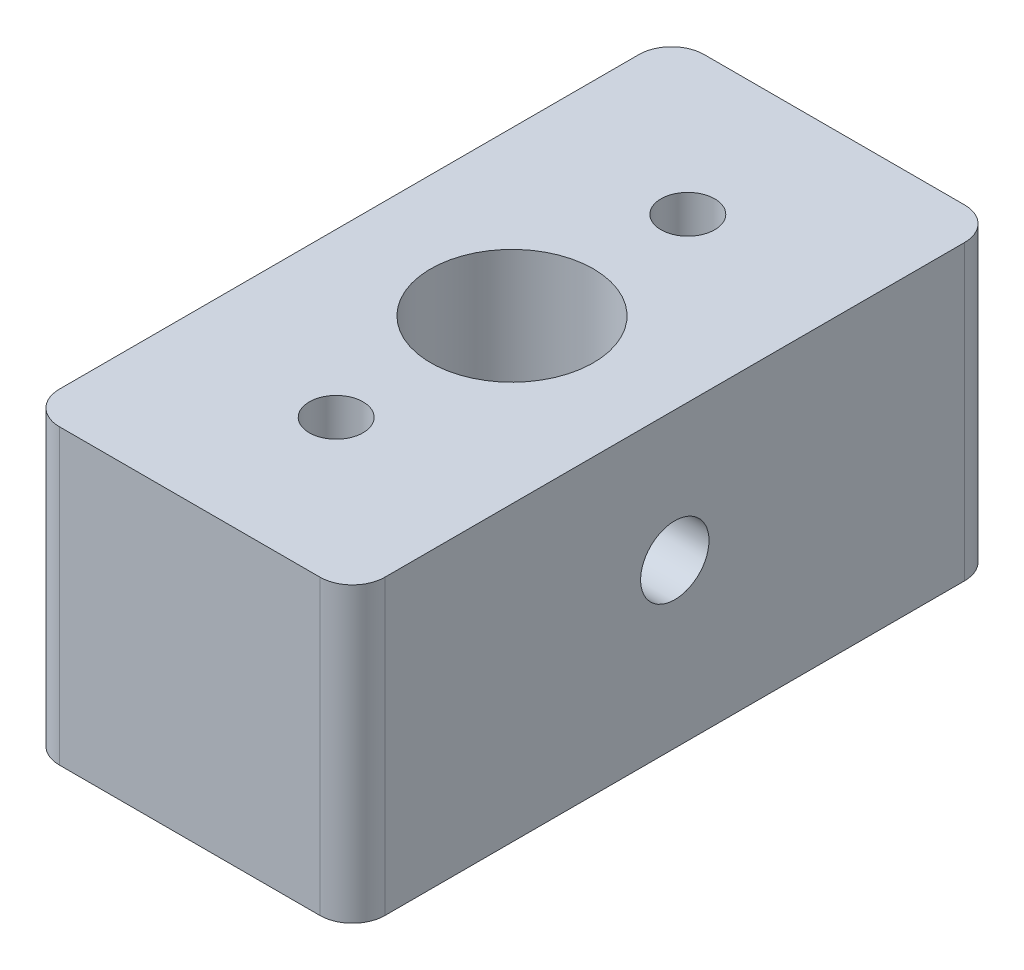
ISO-10303-21;
HEADER;
FILE_DESCRIPTION(('STEP AP214'),'2;1');
FILE_NAME('part.step','',(''),(''),'','','');
FILE_SCHEMA(('AUTOMOTIVE_DESIGN { 1 0 10303 214 1 1 1 1 }'));
ENDSEC;
DATA;
#1=APPLICATION_CONTEXT('core data for automotive mechanical design processes');
#2=APPLICATION_PROTOCOL_DEFINITION('international standard','automotive_design',2000,#1);
#3=PRODUCT_CONTEXT('',#1,'mechanical');
#4=PRODUCT('Part','Part','',(#3));
#5=PRODUCT_RELATED_PRODUCT_CATEGORY('part','',(#4));
#6=PRODUCT_DEFINITION_FORMATION('','',#4);
#7=PRODUCT_DEFINITION_CONTEXT('part definition',#1,'design');
#8=PRODUCT_DEFINITION('design','',#6,#7);
#9=PRODUCT_DEFINITION_SHAPE('','',#8);
#10=(LENGTH_UNIT() NAMED_UNIT(*) SI_UNIT(.MILLI.,.METRE.));
#11=(NAMED_UNIT(*) PLANE_ANGLE_UNIT() SI_UNIT($,.RADIAN.));
#12=(NAMED_UNIT(*) SI_UNIT($,.STERADIAN.) SOLID_ANGLE_UNIT());
#13=UNCERTAINTY_MEASURE_WITH_UNIT(LENGTH_MEASURE(1.E-05),#10,'distance_accuracy_value','');
#14=(GEOMETRIC_REPRESENTATION_CONTEXT(3) GLOBAL_UNCERTAINTY_ASSIGNED_CONTEXT((#13)) GLOBAL_UNIT_ASSIGNED_CONTEXT((#10,
#11,#12)) REPRESENTATION_CONTEXT('',''));
#15=CARTESIAN_POINT('',(0.,0.,0.));
#16=DIRECTION('',(0.,0.,1.));
#17=DIRECTION('',(1.,0.,0.));
#18=AXIS2_PLACEMENT_3D('',#15,#16,#17);
#19=CARTESIAN_POINT('',(-10.,9.,-19.8));
#20=DIRECTION('',(-1.,0.,0.));
#21=DIRECTION('',(0.,-1.,0.));
#22=AXIS2_PLACEMENT_3D('',#19,#20,#21);
#23=PLANE('',#22);
#24=DIRECTION('',(0.,0.,1.));
#25=VECTOR('',#24,1.);
#26=CARTESIAN_POINT('',(-10.,9.,-19.8));
#27=LINE('',#26,#25);
#28=CARTESIAN_POINT('',(-10.,9.,-17.8));
#29=VERTEX_POINT('',#28);
#30=CARTESIAN_POINT('',(-10.,9.,17.8));
#31=VERTEX_POINT('',#30);
#32=EDGE_CURVE('E110',#29,#31,#27,.T.);
#33=ORIENTED_EDGE('',*,*,#32,.F.);
#34=DIRECTION('',(0.,-1.,0.));
#35=VECTOR('',#34,1.);
#36=CARTESIAN_POINT('',(-10.,-9.,-17.8));
#37=LINE('',#36,#35);
#38=CARTESIAN_POINT('',(-10.,-9.,-17.8));
#39=VERTEX_POINT('',#38);
#40=EDGE_CURVE('E94',#29,#39,#37,.T.);
#41=ORIENTED_EDGE('',*,*,#40,.T.);
#42=DIRECTION('',(0.,0.,1.));
#43=VECTOR('',#42,1.);
#44=CARTESIAN_POINT('',(-10.,-9.,-19.8));
#45=LINE('',#44,#43);
#46=CARTESIAN_POINT('',(-10.,-9.,17.8));
#47=VERTEX_POINT('',#46);
#48=EDGE_CURVE('E107',#39,#47,#45,.T.);
#49=ORIENTED_EDGE('',*,*,#48,.T.);
#50=DIRECTION('',(0.,-1.,0.));
#51=VECTOR('',#50,1.);
#52=CARTESIAN_POINT('',(-10.,9.,17.8));
#53=LINE('',#52,#51);
#54=EDGE_CURVE('E113',#47,#31,#53,.F.);
#55=ORIENTED_EDGE('',*,*,#54,.T.);
#56=EDGE_LOOP('',(#33,#41,#49,#55));
#57=FACE_BOUND('',#56,.T.);
#58=ADVANCED_FACE('F16',(#57),#23,.T.);
#59=CARTESIAN_POINT('',(-10.,9.,-19.8));
#60=DIRECTION('',(0.,1.,0.));
#61=DIRECTION('',(0.,0.,1.));
#62=AXIS2_PLACEMENT_3D('',#59,#60,#61);
#63=PLANE('',#62);
#64=CARTESIAN_POINT('',(0.,9.,-10.8));
#65=DIRECTION('',(0.,1.,0.));
#66=DIRECTION('',(0.,0.,1.));
#67=AXIS2_PLACEMENT_3D('',#64,#65,#66);
#68=CIRCLE('',#67,1.65);
#69=CARTESIAN_POINT('',(0.,9.,-9.15));
#70=VERTEX_POINT('',#69);
#71=EDGE_CURVE('E144',#70,#70,#68,.T.);
#72=ORIENTED_EDGE('',*,*,#71,.F.);
#73=EDGE_LOOP('',(#72));
#74=FACE_BOUND('',#73,.T.);
#75=CARTESIAN_POINT('',(0.,9.,10.8));
#76=DIRECTION('',(0.,1.,0.));
#77=DIRECTION('',(0.,0.,1.));
#78=AXIS2_PLACEMENT_3D('',#75,#76,#77);
#79=CIRCLE('',#78,1.65);
#80=CARTESIAN_POINT('',(0.,9.,12.45));
#81=VERTEX_POINT('',#80);
#82=EDGE_CURVE('E143',#81,#81,#79,.T.);
#83=ORIENTED_EDGE('',*,*,#82,.F.);
#84=EDGE_LOOP('',(#83));
#85=FACE_BOUND('',#84,.T.);
#86=CARTESIAN_POINT('',(0.,9.,0.));
#87=DIRECTION('',(0.,-1.,0.));
#88=DIRECTION('',(0.,0.,-1.));
#89=AXIS2_PLACEMENT_3D('',#86,#87,#88);
#90=CIRCLE('',#89,5.);
#91=CARTESIAN_POINT('',(0.,9.,-5.));
#92=VERTEX_POINT('',#91);
#93=EDGE_CURVE('E138',#92,#92,#90,.T.);
#94=ORIENTED_EDGE('',*,*,#93,.T.);
#95=EDGE_LOOP('',(#94));
#96=FACE_BOUND('',#95,.T.);
#97=DIRECTION('',(-1.,0.,0.));
#98=VECTOR('',#97,1.);
#99=CARTESIAN_POINT('',(-10.,9.,-19.8));
#100=LINE('',#99,#98);
#101=CARTESIAN_POINT('',(8.,9.,-19.8));
#102=VERTEX_POINT('',#101);
#103=CARTESIAN_POINT('',(-8.,9.,-19.8));
#104=VERTEX_POINT('',#103);
#105=EDGE_CURVE('E120',#102,#104,#100,.T.);
#106=ORIENTED_EDGE('',*,*,#105,.T.);
#107=CARTESIAN_POINT('',(-8.,9.,-17.8));
#108=DIRECTION('',(0.,1.,0.));
#109=DIRECTION('',(0.,0.,1.));
#110=AXIS2_PLACEMENT_3D('',#107,#108,#109);
#111=CIRCLE('',#110,2.);
#112=EDGE_CURVE('E164',#104,#29,#111,.T.);
#113=ORIENTED_EDGE('',*,*,#112,.T.);
#114=ORIENTED_EDGE('',*,*,#32,.T.);
#115=CARTESIAN_POINT('',(-8.,9.,17.8));
#116=DIRECTION('',(0.,1.,0.));
#117=DIRECTION('',(0.,0.,1.));
#118=AXIS2_PLACEMENT_3D('',#115,#116,#117);
#119=CIRCLE('',#118,2.);
#120=CARTESIAN_POINT('',(-8.,9.,19.8));
#121=VERTEX_POINT('',#120);
#122=EDGE_CURVE('E159',#31,#121,#119,.T.);
#123=ORIENTED_EDGE('',*,*,#122,.T.);
#124=DIRECTION('',(-1.,0.,0.));
#125=VECTOR('',#124,1.);
#126=CARTESIAN_POINT('',(-10.,9.,19.8));
#127=LINE('',#126,#125);
#128=CARTESIAN_POINT('',(8.,9.,19.8));
#129=VERTEX_POINT('',#128);
#130=EDGE_CURVE('E180',#129,#121,#127,.T.);
#131=ORIENTED_EDGE('',*,*,#130,.F.);
#132=CARTESIAN_POINT('',(8.,9.,17.8));
#133=DIRECTION('',(0.,1.,0.));
#134=DIRECTION('',(0.,0.,1.));
#135=AXIS2_PLACEMENT_3D('',#132,#133,#134);
#136=CIRCLE('',#135,2.);
#137=CARTESIAN_POINT('',(10.,9.,17.8));
#138=VERTEX_POINT('',#137);
#139=EDGE_CURVE('E38',#129,#138,#136,.T.);
#140=ORIENTED_EDGE('',*,*,#139,.T.);
#141=DIRECTION('',(0.,0.,1.));
#142=VECTOR('',#141,1.);
#143=CARTESIAN_POINT('',(10.,9.,-19.8));
#144=LINE('',#143,#142);
#145=CARTESIAN_POINT('',(10.,9.,-17.8));
#146=VERTEX_POINT('',#145);
#147=EDGE_CURVE('E126',#146,#138,#144,.T.);
#148=ORIENTED_EDGE('',*,*,#147,.F.);
#149=CARTESIAN_POINT('',(8.,9.,-17.8));
#150=DIRECTION('',(0.,1.,0.));
#151=DIRECTION('',(0.,0.,1.));
#152=AXIS2_PLACEMENT_3D('',#149,#150,#151);
#153=CIRCLE('',#152,2.);
#154=EDGE_CURVE('E46',#146,#102,#153,.T.);
#155=ORIENTED_EDGE('',*,*,#154,.T.);
#156=EDGE_LOOP('',(#106,#113,#114,#123,#131,#140,#148,#155));
#157=FACE_BOUND('',#156,.T.);
#158=ADVANCED_FACE('F185',(#74,#85,#96,#157),#63,.T.);
#159=CARTESIAN_POINT('',(10.,9.,-19.8));
#160=DIRECTION('',(1.,0.,0.));
#161=DIRECTION('',(0.,1.,0.));
#162=AXIS2_PLACEMENT_3D('',#159,#160,#161);
#163=PLANE('',#162);
#164=CARTESIAN_POINT('',(10.,1.,0.));
#165=DIRECTION('',(1.,0.,0.));
#166=DIRECTION('',(0.,0.,-1.));
#167=AXIS2_PLACEMENT_3D('',#164,#165,#166);
#168=CIRCLE('',#167,2.1);
#169=CARTESIAN_POINT('',(10.,1.,-2.1));
#170=VERTEX_POINT('',#169);
#171=EDGE_CURVE('E270',#170,#170,#168,.T.);
#172=ORIENTED_EDGE('',*,*,#171,.F.);
#173=EDGE_LOOP('',(#172));
#174=FACE_BOUND('',#173,.T.);
#175=DIRECTION('',(0.,0.,1.));
#176=VECTOR('',#175,1.);
#177=CARTESIAN_POINT('',(10.,-9.,-19.8));
#178=LINE('',#177,#176);
#179=CARTESIAN_POINT('',(10.,-9.,-17.8));
#180=VERTEX_POINT('',#179);
#181=CARTESIAN_POINT('',(10.,-9.,17.8));
#182=VERTEX_POINT('',#181);
#183=EDGE_CURVE('E119',#180,#182,#178,.T.);
#184=ORIENTED_EDGE('',*,*,#183,.F.);
#185=DIRECTION('',(0.,1.,0.));
#186=VECTOR('',#185,1.);
#187=CARTESIAN_POINT('',(10.,9.,-17.8));
#188=LINE('',#187,#186);
#189=EDGE_CURVE('E170',#180,#146,#188,.T.);
#190=ORIENTED_EDGE('',*,*,#189,.T.);
#191=ORIENTED_EDGE('',*,*,#147,.T.);
#192=DIRECTION('',(0.,1.,0.));
#193=VECTOR('',#192,1.);
#194=CARTESIAN_POINT('',(10.,9.,17.8));
#195=LINE('',#194,#193);
#196=EDGE_CURVE('E167',#138,#182,#195,.F.);
#197=ORIENTED_EDGE('',*,*,#196,.T.);
#198=EDGE_LOOP('',(#184,#190,#191,#197));
#199=FACE_BOUND('',#198,.T.);
#200=ADVANCED_FACE('F200',(#174,#199),#163,.T.);
#201=CARTESIAN_POINT('',(-10.,-9.,-19.8));
#202=DIRECTION('',(0.,-1.,0.));
#203=DIRECTION('',(0.,0.,-1.));
#204=AXIS2_PLACEMENT_3D('',#201,#202,#203);
#205=PLANE('',#204);
#206=CARTESIAN_POINT('',(0.,-9.,-10.8));
#207=DIRECTION('',(0.,-1.,0.));
#208=DIRECTION('',(0.,0.,-1.));
#209=AXIS2_PLACEMENT_3D('',#206,#207,#208);
#210=CIRCLE('',#209,1.65);
#211=CARTESIAN_POINT('',(0.,-9.,-12.45));
#212=VERTEX_POINT('',#211);
#213=EDGE_CURVE('E139',#212,#212,#210,.T.);
#214=ORIENTED_EDGE('',*,*,#213,.F.);
#215=EDGE_LOOP('',(#214));
#216=FACE_BOUND('',#215,.T.);
#217=CARTESIAN_POINT('',(0.,-9.,10.8));
#218=DIRECTION('',(0.,-1.,0.));
#219=DIRECTION('',(0.,0.,-1.));
#220=AXIS2_PLACEMENT_3D('',#217,#218,#219);
#221=CIRCLE('',#220,1.65);
#222=CARTESIAN_POINT('',(0.,-9.,9.15));
#223=VERTEX_POINT('',#222);
#224=EDGE_CURVE('E283',#223,#223,#221,.T.);
#225=ORIENTED_EDGE('',*,*,#224,.F.);
#226=EDGE_LOOP('',(#225));
#227=FACE_BOUND('',#226,.T.);
#228=CARTESIAN_POINT('',(0.,-9.,0.));
#229=DIRECTION('',(0.,1.,0.));
#230=DIRECTION('',(0.,0.,1.));
#231=AXIS2_PLACEMENT_3D('',#228,#229,#230);
#232=CIRCLE('',#231,2.75);
#233=CARTESIAN_POINT('',(0.,-9.,2.75));
#234=VERTEX_POINT('',#233);
#235=EDGE_CURVE('E137',#234,#234,#232,.T.);
#236=ORIENTED_EDGE('',*,*,#235,.T.);
#237=EDGE_LOOP('',(#236));
#238=FACE_BOUND('',#237,.T.);
#239=ORIENTED_EDGE('',*,*,#48,.F.);
#240=CARTESIAN_POINT('',(-8.,-9.,-17.8));
#241=DIRECTION('',(0.,-1.,0.));
#242=DIRECTION('',(0.,0.,-1.));
#243=AXIS2_PLACEMENT_3D('',#240,#241,#242);
#244=CIRCLE('',#243,2.);
#245=CARTESIAN_POINT('',(-8.,-9.,-19.8));
#246=VERTEX_POINT('',#245);
#247=EDGE_CURVE('E90',#39,#246,#244,.T.);
#248=ORIENTED_EDGE('',*,*,#247,.T.);
#249=DIRECTION('',(1.,0.,0.));
#250=VECTOR('',#249,1.);
#251=CARTESIAN_POINT('',(-10.,-9.,-19.8));
#252=LINE('',#251,#250);
#253=CARTESIAN_POINT('',(8.,-9.,-19.8));
#254=VERTEX_POINT('',#253);
#255=EDGE_CURVE('E129',#246,#254,#252,.T.);
#256=ORIENTED_EDGE('',*,*,#255,.T.);
#257=CARTESIAN_POINT('',(8.,-9.,-17.8));
#258=DIRECTION('',(0.,-1.,0.));
#259=DIRECTION('',(0.,0.,-1.));
#260=AXIS2_PLACEMENT_3D('',#257,#258,#259);
#261=CIRCLE('',#260,2.);
#262=EDGE_CURVE('E102',#254,#180,#261,.T.);
#263=ORIENTED_EDGE('',*,*,#262,.T.);
#264=ORIENTED_EDGE('',*,*,#183,.T.);
#265=CARTESIAN_POINT('',(8.,-9.,17.8));
#266=DIRECTION('',(0.,-1.,0.));
#267=DIRECTION('',(0.,0.,-1.));
#268=AXIS2_PLACEMENT_3D('',#265,#266,#267);
#269=CIRCLE('',#268,2.);
#270=CARTESIAN_POINT('',(8.,-9.,19.8));
#271=VERTEX_POINT('',#270);
#272=EDGE_CURVE('E112',#182,#271,#269,.T.);
#273=ORIENTED_EDGE('',*,*,#272,.T.);
#274=DIRECTION('',(1.,0.,0.));
#275=VECTOR('',#274,1.);
#276=CARTESIAN_POINT('',(-10.,-9.,19.8));
#277=LINE('',#276,#275);
#278=CARTESIAN_POINT('',(-8.,-9.,19.8));
#279=VERTEX_POINT('',#278);
#280=EDGE_CURVE('E182',#279,#271,#277,.T.);
#281=ORIENTED_EDGE('',*,*,#280,.F.);
#282=CARTESIAN_POINT('',(-8.,-9.,17.8));
#283=DIRECTION('',(0.,-1.,0.));
#284=DIRECTION('',(0.,0.,-1.));
#285=AXIS2_PLACEMENT_3D('',#282,#283,#284);
#286=CIRCLE('',#285,2.);
#287=EDGE_CURVE('E117',#279,#47,#286,.T.);
#288=ORIENTED_EDGE('',*,*,#287,.T.);
#289=EDGE_LOOP('',(#239,#248,#256,#263,#264,#273,#281,#288));
#290=FACE_BOUND('',#289,.T.);
#291=ADVANCED_FACE('F115',(#216,#227,#238,#290),#205,.T.);
#292=CARTESIAN_POINT('',(0.,0.,-19.8));
#293=DIRECTION('',(0.,0.,1.));
#294=DIRECTION('',(1.,0.,0.));
#295=AXIS2_PLACEMENT_3D('',#292,#293,#294);
#296=PLANE('',#295);
#297=ORIENTED_EDGE('',*,*,#255,.F.);
#298=DIRECTION('',(0.,-1.,0.));
#299=VECTOR('',#298,1.);
#300=CARTESIAN_POINT('',(-8.,9.,-19.8));
#301=LINE('',#300,#299);
#302=EDGE_CURVE('E95',#246,#104,#301,.F.);
#303=ORIENTED_EDGE('',*,*,#302,.T.);
#304=ORIENTED_EDGE('',*,*,#105,.F.);
#305=DIRECTION('',(0.,1.,0.));
#306=VECTOR('',#305,1.);
#307=CARTESIAN_POINT('',(8.,-9.,-19.8));
#308=LINE('',#307,#306);
#309=EDGE_CURVE('E101',#102,#254,#308,.F.);
#310=ORIENTED_EDGE('',*,*,#309,.T.);
#311=EDGE_LOOP('',(#297,#303,#304,#310));
#312=FACE_BOUND('',#311,.T.);
#313=ADVANCED_FACE('F205',(#312),#296,.F.);
#314=CARTESIAN_POINT('',(0.,0.,19.8));
#315=DIRECTION('',(0.,0.,1.));
#316=DIRECTION('',(1.,0.,0.));
#317=AXIS2_PLACEMENT_3D('',#314,#315,#316);
#318=PLANE('',#317);
#319=ORIENTED_EDGE('',*,*,#130,.T.);
#320=DIRECTION('',(0.,-1.,0.));
#321=VECTOR('',#320,1.);
#322=CARTESIAN_POINT('',(-8.,0.,19.8));
#323=LINE('',#322,#321);
#324=EDGE_CURVE('E11',#121,#279,#323,.T.);
#325=ORIENTED_EDGE('',*,*,#324,.T.);
#326=ORIENTED_EDGE('',*,*,#280,.T.);
#327=DIRECTION('',(0.,1.,0.));
#328=VECTOR('',#327,1.);
#329=CARTESIAN_POINT('',(8.,0.,19.8));
#330=LINE('',#329,#328);
#331=EDGE_CURVE('E31',#271,#129,#330,.T.);
#332=ORIENTED_EDGE('',*,*,#331,.T.);
#333=EDGE_LOOP('',(#319,#325,#326,#332));
#334=FACE_BOUND('',#333,.T.);
#335=ADVANCED_FACE('F179',(#334),#318,.T.);
#336=CARTESIAN_POINT('',(0.,9.,0.));
#337=DIRECTION('',(0.,-1.,0.));
#338=DIRECTION('',(0.,0.,-1.));
#339=AXIS2_PLACEMENT_3D('',#336,#337,#338);
#340=CYLINDRICAL_SURFACE('',#339,2.75);
#341=CARTESIAN_POINT('',(0.,-4.,0.));
#342=DIRECTION('',(0.,-1.,0.));
#343=DIRECTION('',(0.,0.,-1.));
#344=AXIS2_PLACEMENT_3D('',#341,#342,#343);
#345=CIRCLE('',#344,2.75);
#346=CARTESIAN_POINT('',(0.,-4.,-2.75));
#347=VERTEX_POINT('',#346);
#348=EDGE_CURVE('E133',#347,#347,#345,.T.);
#349=ORIENTED_EDGE('',*,*,#348,.F.);
#350=EDGE_LOOP('',(#349));
#351=FACE_BOUND('',#350,.T.);
#352=ORIENTED_EDGE('',*,*,#235,.F.);
#353=EDGE_LOOP('',(#352));
#354=FACE_BOUND('',#353,.T.);
#355=ADVANCED_FACE('F253',(#351,#354),#340,.F.);
#356=CARTESIAN_POINT('',(0.,9.,0.));
#357=DIRECTION('',(0.,-1.,0.));
#358=DIRECTION('',(0.,0.,-1.));
#359=AXIS2_PLACEMENT_3D('',#356,#357,#358);
#360=CYLINDRICAL_SURFACE('',#359,5.);
#361=CARTESIAN_POINT('',(4.53762052181537,1.,-2.1));
#362=CARTESIAN_POINT('',(4.53762943405603,1.1119250215795,-2.09999093921855));
#363=CARTESIAN_POINT('',(4.54182056190798,1.22401463058945,-2.09099762013233));
#364=CARTESIAN_POINT('',(4.5580436120359,1.4449609905618,-2.05538295735073));
#365=CARTESIAN_POINT('',(4.57009666707434,1.55380819902675,-2.02871409890585));
#366=CARTESIAN_POINT('',(4.60041935380906,1.7646621999424,-1.95897145018737));
#367=CARTESIAN_POINT('',(4.6186633347609,1.86669517085879,-1.91596526359135));
#368=CARTESIAN_POINT('',(4.65927465681673,2.06206955023301,-1.81496848628035));
#369=CARTESIAN_POINT('',(4.68164106832602,2.15541291104179,-1.75698127255649));
#370=CARTESIAN_POINT('',(4.72955907129733,2.33671724330485,-1.62374740147949));
#371=CARTESIAN_POINT('',(4.755219776632,2.42406233325485,-1.54770150900604));
#372=CARTESIAN_POINT('',(4.80593888124811,2.58521580093076,-1.38218673378419));
#373=CARTESIAN_POINT('',(4.83099704283745,2.65901891032727,-1.29271265147996));
#374=CARTESIAN_POINT('',(4.87901754682325,2.79415229795834,-1.09802657081059));
#375=CARTESIAN_POINT('',(4.90183831897403,2.85478717867416,-0.992293792277616));
#376=CARTESIAN_POINT('',(4.94147445225016,2.95714229347264,-0.7709968007207));
#377=CARTESIAN_POINT('',(4.95829251912188,2.99887105186571,-0.655437046410569));
#378=CARTESIAN_POINT('',(4.98325405033125,3.0599896837342,-0.424234923140873));
#379=CARTESIAN_POINT('',(4.99180846788813,3.08044225007981,-0.308918758384998));
#380=CARTESIAN_POINT('',(5.00077313697796,3.10186418581282,-0.0761953640483106));
#381=CARTESIAN_POINT('',(5.00118674810494,3.10284159232138,0.0412109829216853));
#382=CARTESIAN_POINT('',(4.99406347006892,3.08583701233113,0.267045691992889));
#383=CARTESIAN_POINT('',(4.987016486703,3.06902332811793,0.375580389240538));
#384=CARTESIAN_POINT('',(4.96643913228808,3.01891976810438,0.588121453972402));
#385=CARTESIAN_POINT('',(4.95290828291428,2.98562867673432,0.692127486752447));
#386=CARTESIAN_POINT('',(4.92040872616599,2.90312291562026,0.894571592733619));
#387=CARTESIAN_POINT('',(4.90136010164063,2.85367274835416,0.992900328996023));
#388=CARTESIAN_POINT('',(4.85968358817454,2.74048555525023,1.18012201231841));
#389=CARTESIAN_POINT('',(4.83705442870328,2.67674345464769,1.26901159117052));
#390=CARTESIAN_POINT('',(4.78857382294645,2.53148674860765,1.44158231126841));
#391=CARTESIAN_POINT('',(4.76260766855617,2.44902762604873,1.52443735050639));
#392=CARTESIAN_POINT('',(4.71158770832487,2.27133595771934,1.67550358285698));
#393=CARTESIAN_POINT('',(4.68653426922284,2.17609834784709,1.74370894230208));
#394=CARTESIAN_POINT('',(4.63934954945429,1.97148600567606,1.8657088163384));
#395=CARTESIAN_POINT('',(4.61734588251364,1.86174187071878,1.91893740609922));
#396=CARTESIAN_POINT('',(4.58027780282422,1.63367831523168,2.00581972046166));
#397=CARTESIAN_POINT('',(4.56520833719538,1.51536521181537,2.03948770338621));
#398=CARTESIAN_POINT('',(4.54497374255013,1.28180508989141,2.08417383444552));
#399=CARTESIAN_POINT('',(4.53922360692427,1.16686628670692,2.09653322865707));
#400=CARTESIAN_POINT('',(4.53660537717822,0.936437932909894,2.10219613225766));
#401=CARTESIAN_POINT('',(4.53973412710196,0.820948592551162,2.09550641255737));
#402=CARTESIAN_POINT('',(4.55391594117544,0.600672712785917,2.0644854956339));
#403=CARTESIAN_POINT('',(4.56443644880221,0.495680666308695,2.04133871755658));
#404=CARTESIAN_POINT('',(4.59153178478493,0.291160527672104,1.97963699914412));
#405=CARTESIAN_POINT('',(4.60810804338437,0.191633732685333,1.94107841865651));
#406=CARTESIAN_POINT('',(4.64630819142541,-0.00388018358943591,1.84782427546042));
#407=CARTESIAN_POINT('',(4.66811731814015,-0.0995349373014981,1.79251022606962));
#408=CARTESIAN_POINT('',(4.71406644326658,-0.28066928628021,1.66792729869739));
#409=CARTESIAN_POINT('',(4.73820745950213,-0.366144401657247,1.59865231257984));
#410=CARTESIAN_POINT('',(4.78851713924143,-0.531875999587322,1.44134105705571));
#411=CARTESIAN_POINT('',(4.81468784601061,-0.61111104666185,1.35222504205725));
#412=CARTESIAN_POINT('',(4.86425275862533,-0.753690764609769,1.1613598024618));
#413=CARTESIAN_POINT('',(4.88764674095218,-0.817034156705089,1.05960956219155));
#414=CARTESIAN_POINT('',(4.92919128625038,-0.926000563791988,0.845565277086983));
#415=CARTESIAN_POINT('',(4.94732489574633,-0.971566443471119,0.733238653288985));
#416=CARTESIAN_POINT('',(4.97614642645122,-1.04281807511937,0.501555646359178));
#417=CARTESIAN_POINT('',(4.98683885771429,-1.06851587006697,0.382203568977616));
#418=CARTESIAN_POINT('',(4.99904696623384,-1.0977675487916,0.148979892957936));
#419=CARTESIAN_POINT('',(5.00115896707158,-1.10276090687133,0.0353188535759015));
#420=CARTESIAN_POINT('',(4.99762625782031,-1.0943459505535,-0.191184274899434));
#421=CARTESIAN_POINT('',(4.99198294645839,-1.0809409544338,-0.304026507980725));
#422=CARTESIAN_POINT('',(4.97388965984129,-1.0371433091974,-0.521441961146401));
#423=CARTESIAN_POINT('',(4.96169547376985,-1.00738813926432,-0.626166665323006));
#424=CARTESIAN_POINT('',(4.93184875416263,-0.932436398476547,-0.82909365999046));
#425=CARTESIAN_POINT('',(4.91419519252122,-0.887236918992401,-0.927294717717865));
#426=CARTESIAN_POINT('',(4.87413935349895,-0.78039142799545,-1.11929420547977));
#427=CARTESIAN_POINT('',(4.85155806912578,-0.718092683601563,-1.21269118530039));
#428=CARTESIAN_POINT('',(4.80431345568246,-0.579763423182137,-1.38810582864928));
#429=CARTESIAN_POINT('',(4.77964934072141,-0.503727711501631,-1.47011916578165));
#430=CARTESIAN_POINT('',(4.72886675897237,-0.333860368325283,-1.62635503698247));
#431=CARTESIAN_POINT('',(4.70276600530214,-0.239160453718016,-1.6996433073625));
#432=CARTESIAN_POINT('',(4.65381604974822,-0.0380368924478469,-1.82943196277361));
#433=CARTESIAN_POINT('',(4.63096868777353,0.0683933282432358,-1.88592286779045));
#434=CARTESIAN_POINT('',(4.59155474401165,0.289979613092961,-1.9799614156303));
#435=CARTESIAN_POINT('',(4.57496066839713,0.405094744772226,-2.01759222757015));
#436=CARTESIAN_POINT('',(4.55648361689111,0.581671608935875,-2.05880188606212));
#437=CARTESIAN_POINT('',(4.55139543388181,0.641122120070958,-2.06999554025264));
#438=CARTESIAN_POINT('',(4.54352453834359,0.76090687236721,-2.08721875436019));
#439=CARTESIAN_POINT('',(4.54074022005941,0.821240468134224,-2.09325191115689));
#440=CARTESIAN_POINT('',(4.53813405720839,0.921101700322785,-2.09888970982883));
#441=CARTESIAN_POINT('',(4.53761737978804,0.960540621641974,-2.10000319439566));
#442=CARTESIAN_POINT('',(4.53762052181537,1.,-2.1));
#443=B_SPLINE_CURVE_WITH_KNOTS('',3,(#361,#362,#363,#364,#365,#366,#367,#368,#369,#370,#371,
#372,#373,#374,#375,#376,#377,#378,#379,#380,#381,#382,#383,#384,#385,#386,#387,#388,#389,#390,
#391,#392,#393,#394,#395,#396,#397,#398,#399,#400,#401,#402,#403,#404,#405,#406,#407,#408,#409,
#410,#411,#412,#413,#414,#415,#416,#417,#418,#419,#420,#421,#422,#423,#424,#425,#426,#427,#428,
#429,#430,#431,#432,#433,#434,#435,#436,#437,#438,#439,#440,#441,#442),.UNSPECIFIED.,.T.,.F.,(4,
2,2,2,2,2,2,2,2,2,2,2,2,2,2,2,2,2,2,2,2,2,2,2,2,2,2,2,2,2,2,2,2,2,2,2,2,2,2,2,4),(0.,
0.335635656606174,0.672177236307956,1.00734111814836,1.34242951388391,1.69673924977881,
2.05118653430915,2.42129877812726,2.79124398086996,3.14166571369558,3.49194282946524,
3.82056640937212,4.14921423608075,4.48288287547887,4.81667018174637,5.17430973536724,
5.53209144212976,5.90198342971284,6.27160545236008,6.61697414039907,6.96222008421921,
7.28484865641397,7.60755347613733,7.9440312851303,8.28065662947256,8.64521235173312,
9.00979739985345,9.37554472437895,9.74107017809824,10.080706569048,10.4202817121371,
10.7474704702579,11.0747208818873,11.4168078835367,11.7590245427136,12.1249656183702,
12.4911128317486,12.8556308833965,13.0375398024424,13.2193218269542,13.3376508134272),.UNSPECIFIED.);
#444=CARTESIAN_POINT('',(4.53762052181537,1.,-2.1));
#445=VERTEX_POINT('',#444);
#446=EDGE_CURVE('E20',#445,#445,#443,.T.);
#447=ORIENTED_EDGE('',*,*,#446,.T.);
#448=EDGE_LOOP('',(#447));
#449=FACE_BOUND('',#448,.T.);
#450=ORIENTED_EDGE('',*,*,#93,.F.);
#451=EDGE_LOOP('',(#450));
#452=FACE_BOUND('',#451,.T.);
#453=CARTESIAN_POINT('',(0.,-4.,0.));
#454=DIRECTION('',(0.,-1.,0.));
#455=DIRECTION('',(0.,0.,-1.));
#456=AXIS2_PLACEMENT_3D('',#453,#454,#455);
#457=CIRCLE('',#456,5.);
#458=CARTESIAN_POINT('',(0.,-4.,-5.));
#459=VERTEX_POINT('',#458);
#460=EDGE_CURVE('E287',#459,#459,#457,.T.);
#461=ORIENTED_EDGE('',*,*,#460,.T.);
#462=EDGE_LOOP('',(#461));
#463=FACE_BOUND('',#462,.T.);
#464=ADVANCED_FACE('F248',(#449,#452,#463),#360,.F.);
#465=CARTESIAN_POINT('',(0.,-4.,0.));
#466=DIRECTION('',(0.,-1.,0.));
#467=DIRECTION('',(0.,0.,-1.));
#468=AXIS2_PLACEMENT_3D('',#465,#466,#467);
#469=PLANE('',#468);
#470=ORIENTED_EDGE('',*,*,#348,.T.);
#471=EDGE_LOOP('',(#470));
#472=FACE_BOUND('',#471,.T.);
#473=ORIENTED_EDGE('',*,*,#460,.F.);
#474=EDGE_LOOP('',(#473));
#475=FACE_BOUND('',#474,.T.);
#476=ADVANCED_FACE('F241',(#472,#475),#469,.F.);
#477=CARTESIAN_POINT('',(0.,9.,10.8));
#478=DIRECTION('',(0.,1.,0.));
#479=DIRECTION('',(0.,0.,1.));
#480=AXIS2_PLACEMENT_3D('',#477,#478,#479);
#481=CYLINDRICAL_SURFACE('',#480,1.65);
#482=ORIENTED_EDGE('',*,*,#224,.T.);
#483=EDGE_LOOP('',(#482));
#484=FACE_BOUND('',#483,.T.);
#485=ORIENTED_EDGE('',*,*,#82,.T.);
#486=EDGE_LOOP('',(#485));
#487=FACE_BOUND('',#486,.T.);
#488=ADVANCED_FACE('F234',(#484,#487),#481,.F.);
#489=CARTESIAN_POINT('',(0.,9.,-10.8));
#490=DIRECTION('',(0.,1.,0.));
#491=DIRECTION('',(0.,0.,1.));
#492=AXIS2_PLACEMENT_3D('',#489,#490,#491);
#493=CYLINDRICAL_SURFACE('',#492,1.65);
#494=ORIENTED_EDGE('',*,*,#213,.T.);
#495=EDGE_LOOP('',(#494));
#496=FACE_BOUND('',#495,.T.);
#497=ORIENTED_EDGE('',*,*,#71,.T.);
#498=EDGE_LOOP('',(#497));
#499=FACE_BOUND('',#498,.T.);
#500=ADVANCED_FACE('F229',(#496,#499),#493,.F.);
#501=CARTESIAN_POINT('',(-8.,9.,-17.8));
#502=DIRECTION('',(0.,1.,0.));
#503=DIRECTION('',(-1.,0.,0.));
#504=AXIS2_PLACEMENT_3D('',#501,#502,#503);
#505=CYLINDRICAL_SURFACE('',#504,2.);
#506=ORIENTED_EDGE('',*,*,#112,.F.);
#507=ORIENTED_EDGE('',*,*,#302,.F.);
#508=ORIENTED_EDGE('',*,*,#247,.F.);
#509=ORIENTED_EDGE('',*,*,#40,.F.);
#510=EDGE_LOOP('',(#506,#507,#508,#509));
#511=FACE_BOUND('',#510,.T.);
#512=ADVANCED_FACE('F93',(#511),#505,.T.);
#513=CARTESIAN_POINT('',(8.,9.,-17.8));
#514=DIRECTION('',(0.,-1.,0.));
#515=DIRECTION('',(1.,0.,0.));
#516=AXIS2_PLACEMENT_3D('',#513,#514,#515);
#517=CYLINDRICAL_SURFACE('',#516,2.);
#518=ORIENTED_EDGE('',*,*,#262,.F.);
#519=ORIENTED_EDGE('',*,*,#309,.F.);
#520=ORIENTED_EDGE('',*,*,#154,.F.);
#521=ORIENTED_EDGE('',*,*,#189,.F.);
#522=EDGE_LOOP('',(#518,#519,#520,#521));
#523=FACE_BOUND('',#522,.T.);
#524=ADVANCED_FACE('F202',(#523),#517,.T.);
#525=CARTESIAN_POINT('',(-8.,0.,17.8));
#526=DIRECTION('',(0.,-1.,0.));
#527=DIRECTION('',(1.,0.,0.));
#528=AXIS2_PLACEMENT_3D('',#525,#526,#527);
#529=CYLINDRICAL_SURFACE('',#528,2.);
#530=ORIENTED_EDGE('',*,*,#122,.F.);
#531=ORIENTED_EDGE('',*,*,#54,.F.);
#532=ORIENTED_EDGE('',*,*,#287,.F.);
#533=ORIENTED_EDGE('',*,*,#324,.F.);
#534=EDGE_LOOP('',(#530,#531,#532,#533));
#535=FACE_BOUND('',#534,.T.);
#536=ADVANCED_FACE('F207',(#535),#529,.T.);
#537=CARTESIAN_POINT('',(8.,0.,17.8));
#538=DIRECTION('',(0.,1.,0.));
#539=DIRECTION('',(-1.,0.,0.));
#540=AXIS2_PLACEMENT_3D('',#537,#538,#539);
#541=CYLINDRICAL_SURFACE('',#540,2.);
#542=ORIENTED_EDGE('',*,*,#272,.F.);
#543=ORIENTED_EDGE('',*,*,#196,.F.);
#544=ORIENTED_EDGE('',*,*,#139,.F.);
#545=ORIENTED_EDGE('',*,*,#331,.F.);
#546=EDGE_LOOP('',(#542,#543,#544,#545));
#547=FACE_BOUND('',#546,.T.);
#548=ADVANCED_FACE('F18',(#547),#541,.T.);
#549=CARTESIAN_POINT('',(10.,1.,0.));
#550=DIRECTION('',(1.,0.,0.));
#551=DIRECTION('',(0.,0.,-1.));
#552=AXIS2_PLACEMENT_3D('',#549,#550,#551);
#553=CYLINDRICAL_SURFACE('',#552,2.1);
#554=ORIENTED_EDGE('',*,*,#171,.T.);
#555=EDGE_LOOP('',(#554));
#556=FACE_BOUND('',#555,.T.);
#557=ORIENTED_EDGE('',*,*,#446,.F.);
#558=EDGE_LOOP('',(#557));
#559=FACE_BOUND('',#558,.T.);
#560=ADVANCED_FACE('F215',(#556,#559),#553,.F.);
#561=CLOSED_SHELL('',(#58,#158,#200,#291,#313,#335,#355,#464,#476,#488,#500,#512,#524,#536,#548,#560));
#562=MANIFOLD_SOLID_BREP('B1',#561);
#563=ADVANCED_BREP_SHAPE_REPRESENTATION('',(#18,#562),#14);
#564=SHAPE_DEFINITION_REPRESENTATION(#9,#563);
ENDSEC;
END-ISO-10303-21;
